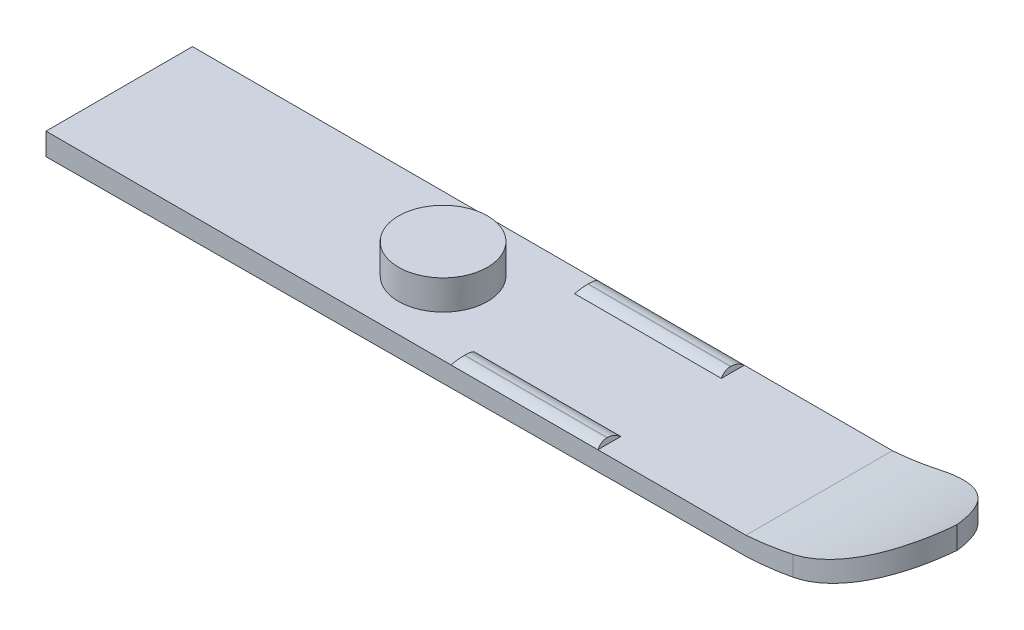
ISO-10303-21;
HEADER;
FILE_DESCRIPTION(('STEP AP214'),'2;1');
FILE_NAME('part.step','',(''),(''),'','','');
FILE_SCHEMA(('AUTOMOTIVE_DESIGN { 1 0 10303 214 1 1 1 1 }'));
ENDSEC;
DATA;
#1=APPLICATION_CONTEXT('core data for automotive mechanical design processes');
#2=APPLICATION_PROTOCOL_DEFINITION('international standard','automotive_design',2000,#1);
#3=PRODUCT_CONTEXT('',#1,'mechanical');
#4=PRODUCT('Part','Part','',(#3));
#5=PRODUCT_RELATED_PRODUCT_CATEGORY('part','',(#4));
#6=PRODUCT_DEFINITION_FORMATION('','',#4);
#7=PRODUCT_DEFINITION_CONTEXT('part definition',#1,'design');
#8=PRODUCT_DEFINITION('design','',#6,#7);
#9=PRODUCT_DEFINITION_SHAPE('','',#8);
#10=(LENGTH_UNIT() NAMED_UNIT(*) SI_UNIT(.MILLI.,.METRE.));
#11=(NAMED_UNIT(*) PLANE_ANGLE_UNIT() SI_UNIT($,.RADIAN.));
#12=(NAMED_UNIT(*) SI_UNIT($,.STERADIAN.) SOLID_ANGLE_UNIT());
#13=UNCERTAINTY_MEASURE_WITH_UNIT(LENGTH_MEASURE(1.E-05),#10,'distance_accuracy_value','');
#14=(GEOMETRIC_REPRESENTATION_CONTEXT(3) GLOBAL_UNCERTAINTY_ASSIGNED_CONTEXT((#13)) GLOBAL_UNIT_ASSIGNED_CONTEXT((#10,
#11,#12)) REPRESENTATION_CONTEXT('',''));
#15=CARTESIAN_POINT('',(0.,0.,0.));
#16=DIRECTION('',(0.,0.,1.));
#17=DIRECTION('',(1.,0.,0.));
#18=AXIS2_PLACEMENT_3D('',#15,#16,#17);
#19=CARTESIAN_POINT('',(-20.3714692927911,1.20972602212736,7.9));
#20=DIRECTION('',(0.,-1.,0.));
#21=DIRECTION('',(0.,0.,-1.));
#22=AXIS2_PLACEMENT_3D('',#19,#20,#21);
#23=PLANE('',#22);
#24=CARTESIAN_POINT('',(-2.90200639518944,1.20972602212736,3.95));
#25=DIRECTION('',(0.,-1.,0.));
#26=DIRECTION('',(0.,0.,-1.));
#27=AXIS2_PLACEMENT_3D('',#24,#25,#26);
#28=CIRCLE('',#27,2.4);
#29=CARTESIAN_POINT('',(-2.90200639518944,1.20972602212736,1.55));
#30=VERTEX_POINT('',#29);
#31=EDGE_CURVE('E311',#30,#30,#28,.F.);
#32=ORIENTED_EDGE('',*,*,#31,.F.);
#33=EDGE_LOOP('',(#32));
#34=FACE_BOUND('',#33,.T.);
#35=DIRECTION('',(0.,0.,1.));
#36=VECTOR('',#35,1.);
#37=CARTESIAN_POINT('',(1.47763421060105,1.20972602212736,7.9));
#38=LINE('',#37,#36);
#39=CARTESIAN_POINT('',(1.47763421060105,1.20972602212736,6.66307065033764));
#40=VERTEX_POINT('',#39);
#41=CARTESIAN_POINT('',(1.47763421060105,1.20972602212736,7.9));
#42=VERTEX_POINT('',#41);
#43=EDGE_CURVE('E150',#40,#42,#38,.T.);
#44=ORIENTED_EDGE('',*,*,#43,.F.);
#45=DIRECTION('',(-1.,0.,0.));
#46=VECTOR('',#45,1.);
#47=CARTESIAN_POINT('',(1.47763421060105,1.20972602212736,6.66307065033764));
#48=LINE('',#47,#46);
#49=CARTESIAN_POINT('',(9.39983038858128,1.20972602212736,6.66307065033764));
#50=VERTEX_POINT('',#49);
#51=EDGE_CURVE('E161',#50,#40,#48,.T.);
#52=ORIENTED_EDGE('',*,*,#51,.F.);
#53=DIRECTION('',(0.,0.,-1.));
#54=VECTOR('',#53,1.);
#55=CARTESIAN_POINT('',(9.39983038858128,1.20972602212736,6.66307065033764));
#56=LINE('',#55,#54);
#57=CARTESIAN_POINT('',(9.39983038858128,1.20972602212736,7.9));
#58=VERTEX_POINT('',#57);
#59=EDGE_CURVE('E177',#58,#50,#56,.T.);
#60=ORIENTED_EDGE('',*,*,#59,.F.);
#61=DIRECTION('',(-1.,0.,0.));
#62=VECTOR('',#61,1.);
#63=CARTESIAN_POINT('',(-20.3714692927911,1.20972602212736,7.9));
#64=LINE('',#63,#62);
#65=CARTESIAN_POINT('',(17.3880327158776,1.20972602212736,7.9));
#66=VERTEX_POINT('',#65);
#67=EDGE_CURVE('E204',#66,#58,#64,.T.);
#68=ORIENTED_EDGE('',*,*,#67,.F.);
#69=DIRECTION('',(0.,0.,-1.));
#70=VECTOR('',#69,1.);
#71=CARTESIAN_POINT('',(17.3880327158776,1.20972602212736,7.9));
#72=LINE('',#71,#70);
#73=CARTESIAN_POINT('',(17.3880327158776,1.20972602212736,0.));
#74=VERTEX_POINT('',#73);
#75=EDGE_CURVE('E235',#66,#74,#72,.T.);
#76=ORIENTED_EDGE('',*,*,#75,.T.);
#77=DIRECTION('',(-1.,0.,0.));
#78=VECTOR('',#77,1.);
#79=CARTESIAN_POINT('',(-20.3714692927911,1.20972602212736,0.));
#80=LINE('',#79,#78);
#81=CARTESIAN_POINT('',(9.39983038858128,1.20972602212736,0.));
#82=VERTEX_POINT('',#81);
#83=EDGE_CURVE('E218',#74,#82,#80,.T.);
#84=ORIENTED_EDGE('',*,*,#83,.T.);
#85=DIRECTION('',(0.,0.,-1.));
#86=VECTOR('',#85,1.);
#87=CARTESIAN_POINT('',(9.39983038858128,1.20972602212736,1.23692934966236));
#88=LINE('',#87,#86);
#89=CARTESIAN_POINT('',(9.39983038858128,1.20972602212736,1.23692934966236));
#90=VERTEX_POINT('',#89);
#91=EDGE_CURVE('E190',#90,#82,#88,.T.);
#92=ORIENTED_EDGE('',*,*,#91,.F.);
#93=DIRECTION('',(1.,0.,0.));
#94=VECTOR('',#93,1.);
#95=CARTESIAN_POINT('',(1.47763421060105,1.20972602212736,1.23692934966236));
#96=LINE('',#95,#94);
#97=CARTESIAN_POINT('',(1.47763421060105,1.20972602212736,1.23692934966236));
#98=VERTEX_POINT('',#97);
#99=EDGE_CURVE('E193',#98,#90,#96,.T.);
#100=ORIENTED_EDGE('',*,*,#99,.F.);
#101=DIRECTION('',(0.,0.,1.));
#102=VECTOR('',#101,1.);
#103=CARTESIAN_POINT('',(1.47763421060105,1.20972602212736,0.));
#104=LINE('',#103,#102);
#105=CARTESIAN_POINT('',(1.47763421060105,1.20972602212736,0.));
#106=VERTEX_POINT('',#105);
#107=EDGE_CURVE('E170',#106,#98,#104,.T.);
#108=ORIENTED_EDGE('',*,*,#107,.F.);
#109=CARTESIAN_POINT('',(-20.3714692927911,1.20972602212736,0.));
#110=VERTEX_POINT('',#109);
#111=EDGE_CURVE('E217',#106,#110,#80,.T.);
#112=ORIENTED_EDGE('',*,*,#111,.T.);
#113=DIRECTION('',(0.,0.,-1.));
#114=VECTOR('',#113,1.);
#115=CARTESIAN_POINT('',(-20.3714692927911,1.20972602212736,7.9));
#116=LINE('',#115,#114);
#117=CARTESIAN_POINT('',(-20.3714692927911,1.20972602212736,7.9));
#118=VERTEX_POINT('',#117);
#119=EDGE_CURVE('E232',#118,#110,#116,.T.);
#120=ORIENTED_EDGE('',*,*,#119,.F.);
#121=EDGE_CURVE('E163',#42,#118,#64,.T.);
#122=ORIENTED_EDGE('',*,*,#121,.F.);
#123=EDGE_LOOP('',(#44,#52,#60,#68,#76,#84,#92,#100,#108,#112,#120,#122));
#124=FACE_BOUND('',#123,.T.);
#125=ADVANCED_FACE('F41',(#34,#124),#23,.F.);
#126=CARTESIAN_POINT('',(16.0205885131337,19.2104128948966,7.9));
#127=DIRECTION('',(0.,0.,-1.));
#128=DIRECTION('',(-1.,0.,0.));
#129=AXIS2_PLACEMENT_3D('',#126,#127,#128);
#130=CYLINDRICAL_SURFACE('',#129,18.052551939798);
#131=CARTESIAN_POINT('',(19.9383096366509,1.58809486526577,7.9));
#132=CARTESIAN_POINT('',(20.0837722084435,1.62041552146105,7.90001383427936));
#133=CARTESIAN_POINT('',(20.2287991411209,1.65456483707399,7.89365287426201));
#134=CARTESIAN_POINT('',(20.5168941832305,1.72614219842089,7.86851106389944));
#135=CARTESIAN_POINT('',(20.6599630825422,1.76356887410111,7.84973538205175));
#136=CARTESIAN_POINT('',(20.9427710687773,1.84123831097853,7.80016449416714));
#137=CARTESIAN_POINT('',(21.0825185299709,1.88147268637815,7.76940392022163));
#138=CARTESIAN_POINT('',(21.3581716280648,1.9643816242335,7.6962849069032));
#139=CARTESIAN_POINT('',(21.4940769186056,2.00705640564253,7.65392542558031));
#140=CARTESIAN_POINT('',(21.8944146334147,2.13788466961709,7.51018833264277));
#141=CARTESIAN_POINT('',(22.1520793167205,2.22901184082297,7.3920429104518));
#142=CARTESIAN_POINT('',(22.6430744721359,2.4143865242675,7.11473712781345));
#143=CARTESIAN_POINT('',(22.8763829963443,2.50863675172997,6.95554021553236));
#144=CARTESIAN_POINT('',(23.3232602689301,2.69899200929397,6.59168537861588));
#145=CARTESIAN_POINT('',(23.5355175862763,2.79499758734465,6.38534226728231));
#146=CARTESIAN_POINT('',(23.8252589758354,2.93179874554959,6.04859492653628));
#147=CARTESIAN_POINT('',(23.9171177301469,2.97622552025095,5.93171879528925));
#148=CARTESIAN_POINT('',(24.0905502872457,3.06173919118939,5.68945345400096));
#149=CARTESIAN_POINT('',(24.172129274515,3.10282776726372,5.56406858473365));
#150=CARTESIAN_POINT('',(24.3225227351748,3.17983239204903,5.30835908756883));
#151=CARTESIAN_POINT('',(24.3915804344256,3.21584304239531,5.17820598485265));
#152=CARTESIAN_POINT('',(24.5183176086219,3.28281525487773,4.91130152552452));
#153=CARTESIAN_POINT('',(24.5760032965473,3.31377957241364,4.77455382291756));
#154=CARTESIAN_POINT('',(24.6791931588832,3.36974858158,4.49564647826506));
#155=CARTESIAN_POINT('',(24.7247198829205,3.39476429571693,4.35349742083868));
#156=CARTESIAN_POINT('',(24.8030368279536,3.43811985306957,4.06481237080371));
#157=CARTESIAN_POINT('',(24.8358342175239,3.45646345334548,3.91827889752486));
#158=CARTESIAN_POINT('',(24.887291586246,3.48536598831265,3.62709684153431));
#159=CARTESIAN_POINT('',(24.9063881762548,3.49616502133498,3.4825494389603));
#160=CARTESIAN_POINT('',(24.9319149274077,3.51063795080042,3.1920105861324));
#161=CARTESIAN_POINT('',(24.9383467743166,3.51431279552124,3.0460193306656));
#162=CARTESIAN_POINT('',(24.9383096366509,3.51427064585082,2.9));
#163=B_SPLINE_CURVE_WITH_KNOTS('',3,(#131,#132,#133,#134,#135,#136,#137,#138,#139,#140,#141,
#142,#143,#144,#145,#146,#147,#148,#149,#150,#151,#152,#153,#154,#155,#156,#157,#158,#159,#160,
#161,#162),.UNSPECIFIED.,.F.,.F.,(4,2,2,2,2,2,2,2,2,2,2,2,2,2,2,4),(0.,0.446838697406237,
0.893491483937148,1.33886306188571,1.78427466146889,2.67319258880924,3.56290474921737,
4.49156948044443,4.95653090618483,5.42125688736263,5.87566295045468,6.3298200612866,
6.78312896416797,7.23618221266622,7.67406521650563,8.1118899311484),.UNSPECIFIED.);
#164=CARTESIAN_POINT('',(19.9383096366509,1.58809486526577,7.9));
#165=VERTEX_POINT('',#164);
#166=CARTESIAN_POINT('',(24.8268165661744,3.45144785854531,3.95));
#167=VERTEX_POINT('',#166);
#168=EDGE_CURVE('E238',#165,#167,#163,.T.);
#169=ORIENTED_EDGE('',*,*,#168,.T.);
#170=CARTESIAN_POINT('',(24.9383096366509,3.51427064585082,5.));
#171=CARTESIAN_POINT('',(24.9383334055816,3.51429742944345,4.87032216753717));
#172=CARTESIAN_POINT('',(24.9332658339713,3.51140535585177,4.74065822163368));
#173=CARTESIAN_POINT('',(24.9131273667041,3.49998231363809,4.48241970867545));
#174=CARTESIAN_POINT('',(24.8980612485307,3.49145403810177,4.35384465103151));
#175=CARTESIAN_POINT('',(24.8582068358537,3.469014549252,4.09937171321881));
#176=CARTESIAN_POINT('',(24.833468622304,3.45513106944337,3.97346350904079));
#177=CARTESIAN_POINT('',(24.7745834075047,3.42233680157065,3.72453377469601));
#178=CARTESIAN_POINT('',(24.7404356583829,3.40342561390725,3.60151247482488));
#179=CARTESIAN_POINT('',(24.6631863127689,3.36105749833744,3.35937257874112));
#180=CARTESIAN_POINT('',(24.620101034436,3.33760886008644,3.24024732173192));
#181=CARTESIAN_POINT('',(24.5253792803499,3.28665524180156,3.006325576444));
#182=CARTESIAN_POINT('',(24.4737395494328,3.25914871808774,2.89153075648871));
#183=CARTESIAN_POINT('',(24.306587999863,3.17131397119426,2.55438907258253));
#184=CARTESIAN_POINT('',(24.1788598446506,3.10567959344,2.33933458902198));
#185=CARTESIAN_POINT('',(23.8849092277964,2.96000467665411,1.91863718242123));
#186=CARTESIAN_POINT('',(23.7166305067581,2.87928048430082,1.71468308674813));
#187=CARTESIAN_POINT('',(23.3515070398557,2.7121532358479,1.33678721823465));
#188=CARTESIAN_POINT('',(23.1546486956646,2.6257474872027,1.1628598189728));
#189=CARTESIAN_POINT('',(22.7142549269774,2.44282093259717,0.831310759395116));
#190=CARTESIAN_POINT('',(22.4679836318407,2.34619878635566,0.677371760867853));
#191=CARTESIAN_POINT('',(21.9510974824625,2.15758089216579,0.413866222394113));
#192=CARTESIAN_POINT('',(21.6804989804,2.06558210040027,0.304270144726083));
#193=CARTESIAN_POINT('',(21.2841368790089,1.94180223443334,0.182965092553986));
#194=CARTESIAN_POINT('',(21.165410068322,1.90604649477666,0.151351742271734));
#195=CARTESIAN_POINT('',(20.9253928506725,1.83649292462452,0.0968591505892026));
#196=CARTESIAN_POINT('',(20.8041028924519,1.80269475522122,0.0739783934861437));
#197=CARTESIAN_POINT('',(20.5594527002024,1.73730845235968,0.0371884904760836));
#198=CARTESIAN_POINT('',(20.4360905230308,1.70572255545584,0.0232883102388257));
#199=CARTESIAN_POINT('',(20.1880277885934,1.64500706798471,0.00468856477982519));
#200=CARTESIAN_POINT('',(20.0633267490706,1.61587839842107,-7.56516732623364E-06));
#201=CARTESIAN_POINT('',(19.9383096366509,1.58809486526577,0.));
#202=B_SPLINE_CURVE_WITH_KNOTS('',3,(#170,#171,#172,#173,#174,#175,#176,#177,#178,#179,#180,
#181,#182,#183,#184,#185,#186,#187,#188,#189,#190,#191,#192,#193,#194,#195,#196,#197,#198,#199,
#200,#201),.UNSPECIFIED.,.F.,.F.,(4,2,2,2,2,2,2,2,2,2,2,2,2,2,2,4),(0.,0.388880435287676,
0.777575190238171,1.16428343064395,1.55102241558815,1.93706141045994,2.32324764081218,
3.09577701405761,3.92191766795795,4.74845269986249,5.66260052600484,6.57613841317846,
6.95976113095716,7.34331723361619,7.72725566640835,8.11133737122979),.UNSPECIFIED.);
#203=CARTESIAN_POINT('',(19.9383096366509,1.58809486526577,0.));
#204=VERTEX_POINT('',#203);
#205=EDGE_CURVE('E246',#167,#204,#202,.T.);
#206=ORIENTED_EDGE('',*,*,#205,.T.);
#207=CARTESIAN_POINT('',(16.0205885131337,19.2104128948966,0.));
#208=DIRECTION('',(0.,0.,-1.));
#209=DIRECTION('',(1.,0.,0.));
#210=AXIS2_PLACEMENT_3D('',#207,#208,#209);
#211=CIRCLE('',#210,18.052551939798);
#212=EDGE_CURVE('E215',#204,#74,#211,.T.);
#213=ORIENTED_EDGE('',*,*,#212,.T.);
#214=ORIENTED_EDGE('',*,*,#75,.F.);
#215=CARTESIAN_POINT('',(16.0205885131337,19.2104128948966,7.9));
#216=DIRECTION('',(0.,0.,-1.));
#217=DIRECTION('',(1.,0.,0.));
#218=AXIS2_PLACEMENT_3D('',#215,#216,#217);
#219=CIRCLE('',#218,18.052551939798);
#220=EDGE_CURVE('E201',#165,#66,#219,.T.);
#221=ORIENTED_EDGE('',*,*,#220,.F.);
#222=EDGE_LOOP('',(#169,#206,#213,#214,#221));
#223=FACE_BOUND('',#222,.T.);
#224=ADVANCED_FACE('F256',(#223),#130,.F.);
#225=CARTESIAN_POINT('',(-20.3714692927911,0.0137689948609054,7.9));
#226=DIRECTION('',(1.,0.,0.));
#227=DIRECTION('',(0.,0.,-1.));
#228=AXIS2_PLACEMENT_3D('',#225,#226,#227);
#229=PLANE('',#228);
#230=DIRECTION('',(0.,-1.,0.));
#231=VECTOR('',#230,1.);
#232=CARTESIAN_POINT('',(-20.3714692927911,0.0137689948609054,0.));
#233=LINE('',#232,#231);
#234=CARTESIAN_POINT('',(-20.3714692927911,0.0137689948609054,0.));
#235=VERTEX_POINT('',#234);
#236=EDGE_CURVE('E221',#110,#235,#233,.T.);
#237=ORIENTED_EDGE('',*,*,#236,.T.);
#238=DIRECTION('',(0.,0.,-1.));
#239=VECTOR('',#238,1.);
#240=CARTESIAN_POINT('',(-20.3714692927911,0.0137689948609054,7.9));
#241=LINE('',#240,#239);
#242=CARTESIAN_POINT('',(-20.3714692927911,0.0137689948609054,7.9));
#243=VERTEX_POINT('',#242);
#244=EDGE_CURVE('E229',#243,#235,#241,.T.);
#245=ORIENTED_EDGE('',*,*,#244,.F.);
#246=DIRECTION('',(0.,-1.,0.));
#247=VECTOR('',#246,1.);
#248=CARTESIAN_POINT('',(-20.3714692927911,0.0137689948609054,7.9));
#249=LINE('',#248,#247);
#250=EDGE_CURVE('E207',#118,#243,#249,.T.);
#251=ORIENTED_EDGE('',*,*,#250,.F.);
#252=ORIENTED_EDGE('',*,*,#119,.T.);
#253=EDGE_LOOP('',(#237,#245,#251,#252));
#254=FACE_BOUND('',#253,.T.);
#255=ADVANCED_FACE('F260',(#254),#229,.F.);
#256=CARTESIAN_POINT('',(-20.3714692927911,0.0137689948609054,7.9));
#257=DIRECTION('',(-0.00552914138962596,0.999984714180919,0.));
#258=DIRECTION('',(-0.999984714180919,-0.00552914138962596,0.));
#259=AXIS2_PLACEMENT_3D('',#256,#257,#258);
#260=PLANE('',#259);
#261=CARTESIAN_POINT('',(-2.89592794678577,0.110395210834079,3.95));
#262=DIRECTION('',(0.00552914138962596,-0.999984714180919,0.));
#263=DIRECTION('',(0.999984714180919,0.00552914138962596,0.));
#264=AXIS2_PLACEMENT_3D('',#261,#262,#263);
#265=CIRCLE('',#264,1.2);
#266=CARTESIAN_POINT('',(-1.69594628976866,0.11703018050163,3.95));
#267=VERTEX_POINT('',#266);
#268=EDGE_CURVE('E173',#267,#267,#265,.T.);
#269=ORIENTED_EDGE('',*,*,#268,.F.);
#270=EDGE_LOOP('',(#269));
#271=FACE_BOUND('',#270,.T.);
#272=DIRECTION('',(0.999984714180919,0.00552914138962596,0.));
#273=VECTOR('',#272,1.);
#274=CARTESIAN_POINT('',(-20.3714692927911,0.0137689948609054,0.));
#275=LINE('',#274,#273);
#276=CARTESIAN_POINT('',(17.3880327158776,0.222549811654493,0.));
#277=VERTEX_POINT('',#276);
#278=EDGE_CURVE('E223',#235,#277,#275,.T.);
#279=ORIENTED_EDGE('',*,*,#278,.T.);
#280=DIRECTION('',(0.,0.,-1.));
#281=VECTOR('',#280,1.);
#282=CARTESIAN_POINT('',(17.3880327158776,0.222549811654493,7.9));
#283=LINE('',#282,#281);
#284=CARTESIAN_POINT('',(17.3880327158776,0.222549811654493,7.9));
#285=VERTEX_POINT('',#284);
#286=EDGE_CURVE('E214',#285,#277,#283,.T.);
#287=ORIENTED_EDGE('',*,*,#286,.F.);
#288=DIRECTION('',(0.999984714180919,0.00552914138962596,0.));
#289=VECTOR('',#288,1.);
#290=CARTESIAN_POINT('',(-20.3714692927911,0.0137689948609054,7.9));
#291=LINE('',#290,#289);
#292=EDGE_CURVE('E209',#243,#285,#291,.T.);
#293=ORIENTED_EDGE('',*,*,#292,.F.);
#294=ORIENTED_EDGE('',*,*,#244,.T.);
#295=EDGE_LOOP('',(#279,#287,#293,#294));
#296=FACE_BOUND('',#295,.T.);
#297=ADVANCED_FACE('F292',(#271,#296),#260,.F.);
#298=CARTESIAN_POINT('',(16.6540021174641,17.6260747175619,7.9));
#299=DIRECTION('',(0.,0.,-1.));
#300=DIRECTION('',(-1.,0.,0.));
#301=AXIS2_PLACEMENT_3D('',#298,#299,#300);
#302=CYLINDRICAL_SURFACE('',#301,17.4189976769602);
#303=CARTESIAN_POINT('',(16.6540021174641,17.6260747175619,0.));
#304=DIRECTION('',(0.,0.,1.));
#305=DIRECTION('',(1.,0.,0.));
#306=AXIS2_PLACEMENT_3D('',#303,#304,#305);
#307=CIRCLE('',#306,17.4189976769602);
#308=CARTESIAN_POINT('',(19.9383096366509,0.519502758535156,0.));
#309=VERTEX_POINT('',#308);
#310=EDGE_CURVE('E203',#277,#309,#307,.T.);
#311=ORIENTED_EDGE('',*,*,#310,.T.);
#312=CARTESIAN_POINT('',(19.9383096366509,0.519502758535156,0.));
#313=CARTESIAN_POINT('',(20.082349632447,0.547139180155456,-1.47710559769099E-05));
#314=CARTESIAN_POINT('',(20.2260081566969,0.576624058054855,0.00622356787463908));
#315=CARTESIAN_POINT('',(20.5114814264774,0.638946996251726,0.0309002235852575));
#316=CARTESIAN_POINT('',(20.653296890188,0.671783703420837,0.0493336335775546));
#317=CARTESIAN_POINT('',(20.933706654848,0.740388032407411,0.0980227726361486));
#318=CARTESIAN_POINT('',(21.0723092210146,0.776146726279844,0.128243480773935));
#319=CARTESIAN_POINT('',(21.3457870372056,0.850236641531285,0.200102330871485));
#320=CARTESIAN_POINT('',(21.4806619735513,0.888568078480682,0.241741430483611));
#321=CARTESIAN_POINT('',(21.8780907491528,1.00661680675722,0.383062375049114));
#322=CARTESIAN_POINT('',(22.1340354685513,1.08953416617376,0.499251812507506));
#323=CARTESIAN_POINT('',(22.6220434324691,1.25930985503517,0.772009789945697));
#324=CARTESIAN_POINT('',(22.8540858909535,1.3461715215504,0.928613066938709));
#325=CARTESIAN_POINT('',(23.298766423286,1.52240336838673,1.28620555164235));
#326=CARTESIAN_POINT('',(23.5101074588791,1.61171653010243,1.48883994632623));
#327=CARTESIAN_POINT('',(23.8957324799842,1.78235780980427,1.93006317541353));
#328=CARTESIAN_POINT('',(24.0700103202694,1.86368460241701,2.16865796100585));
#329=CARTESIAN_POINT('',(24.2980233391455,1.97367991645979,2.54757996400688));
#330=CARTESIAN_POINT('',(24.3681559063795,2.00818379055536,2.67660383419931));
#331=CARTESIAN_POINT('',(24.4971607671627,2.07256930145668,2.94123698542312));
#332=CARTESIAN_POINT('',(24.5560388944514,2.10245333141415,3.0768428087378));
#333=CARTESIAN_POINT('',(24.6617442029449,2.15671533699844,3.35347114625477));
#334=CARTESIAN_POINT('',(24.7085914805883,2.18110248621698,3.49448416924663));
#335=CARTESIAN_POINT('',(24.7897007039871,2.22367272680258,3.78092221088186));
#336=CARTESIAN_POINT('',(24.8239690649814,2.24185898028462,3.92634493949424));
#337=CARTESIAN_POINT('',(24.8803897421478,2.27195154093074,4.22553122658313));
#338=CARTESIAN_POINT('',(24.9020766101499,2.28361607994093,4.37940864604081));
#339=CARTESIAN_POINT('',(24.92379756949,2.29532061759101,4.61146516288898));
#340=CARTESIAN_POINT('',(24.9292363367831,2.2982567573981,4.689035783985));
#341=CARTESIAN_POINT('',(24.936492859586,2.30217715667328,4.84439916715569));
#342=CARTESIAN_POINT('',(24.9383104350016,2.30316131906292,4.92219194008605));
#343=CARTESIAN_POINT('',(24.9383096366509,2.30315955766192,5.));
#344=B_SPLINE_CURVE_WITH_KNOTS('',3,(#312,#313,#314,#315,#316,#317,#318,#319,#320,#321,#322,
#323,#324,#325,#326,#327,#328,#329,#330,#331,#332,#333,#334,#335,#336,#337,#338,#339,#340,#341,
#342,#343),.UNSPECIFIED.,.F.,.F.,(4,2,2,2,2,2,2,2,2,2,2,2,2,2,2,4),(0.,0.43981669320457,
0.879456530063871,1.31779999427182,1.75618023328379,2.63112254693982,3.50681942150022,
4.42091515307173,5.33516232742926,5.78719733078274,6.23899738256008,6.6900377612416,
7.14084778899181,7.60741777488652,7.84077271830294,8.07413926696033),.UNSPECIFIED.);
#345=CARTESIAN_POINT('',(24.8268165661744,2.24340316620586,3.95));
#346=VERTEX_POINT('',#345);
#347=EDGE_CURVE('E271',#309,#346,#344,.T.);
#348=ORIENTED_EDGE('',*,*,#347,.T.);
#349=CARTESIAN_POINT('',(24.9383096366509,2.30315955766192,2.9));
#350=CARTESIAN_POINT('',(24.938332853705,2.30318582281256,3.03065260516508));
#351=CARTESIAN_POINT('',(24.9331896768801,2.30039180901935,3.16129196987954));
#352=CARTESIAN_POINT('',(24.9127455549839,2.28935787462275,3.42148474059906));
#353=CARTESIAN_POINT('',(24.8974491873509,2.2811204081388,3.55103860934567));
#354=CARTESIAN_POINT('',(24.856971791874,2.25944657211906,3.80749713999408));
#355=CARTESIAN_POINT('',(24.8318390547586,2.24603560593447,3.93441160177417));
#356=CARTESIAN_POINT('',(24.7719960175966,2.21436464824308,4.18534545419849));
#357=CARTESIAN_POINT('',(24.7372850098283,2.19610429842742,4.30936463018033));
#358=CARTESIAN_POINT('',(24.6587292007735,2.155206065155,4.55349679068641));
#359=CARTESIAN_POINT('',(24.6148998300104,2.13257558162978,4.67361598297134));
#360=CARTESIAN_POINT('',(24.5185060054288,2.08342421370272,4.90949154365658));
#361=CARTESIAN_POINT('',(24.465938238074,2.05690185397888,5.02524623656547));
#362=CARTESIAN_POINT('',(24.2957255772735,1.97226963596719,5.36517570795578));
#363=CARTESIAN_POINT('',(24.1655818753924,1.90910028997712,5.5819834638829));
#364=CARTESIAN_POINT('',(23.8664165359673,1.76948403361256,6.00507714119334));
#365=CARTESIAN_POINT('',(23.6954096973321,1.69243913276426,6.20974898323675));
#366=CARTESIAN_POINT('',(23.3242722343588,1.53353639614786,6.58858338333256));
#367=CARTESIAN_POINT('',(23.124128208049,1.4516763559852,6.76273182012659));
#368=CARTESIAN_POINT('',(22.6786035635208,1.28020066299176,7.09219137704735));
#369=CARTESIAN_POINT('',(22.4307373066119,1.19058119291818,7.24418023385036));
#370=CARTESIAN_POINT('',(22.0412074268842,1.06049596936393,7.43860666956024));
#371=CARTESIAN_POINT('',(21.9083810645447,1.01785023152943,7.49783105403783));
#372=CARTESIAN_POINT('',(21.6375419581101,0.934585402456014,7.60465302444171));
#373=CARTESIAN_POINT('',(21.4995318370706,0.893965309801715,7.65225640169372));
#374=CARTESIAN_POINT('',(21.2452550063827,0.822624258188459,7.72763643980568));
#375=CARTESIAN_POINT('',(21.1297092306588,0.791465701327723,7.75745330563563));
#376=CARTESIAN_POINT('',(20.8962982237174,0.731136743852993,7.8088218516998));
#377=CARTESIAN_POINT('',(20.7784334235396,0.701965978182028,7.83037505293438));
#378=CARTESIAN_POINT('',(20.5408320294569,0.645823649564827,7.86501639975513));
#379=CARTESIAN_POINT('',(20.4210938418438,0.618854095723376,7.87809688594137));
#380=CARTESIAN_POINT('',(20.180427948635,0.56732225759281,7.89559432438998));
#381=CARTESIAN_POINT('',(20.0594998273728,0.542760849924558,7.90000813282396));
#382=CARTESIAN_POINT('',(19.9383096366509,0.519502758535158,7.9));
#383=B_SPLINE_CURVE_WITH_KNOTS('',3,(#349,#350,#351,#352,#353,#354,#355,#356,#357,#358,#359,
#360,#361,#362,#363,#364,#365,#366,#367,#368,#369,#370,#371,#372,#373,#374,#375,#376,#377,#378,
#379,#380,#381,#382),.UNSPECIFIED.,.F.,.F.,(4,2,2,2,2,2,2,2,2,2,2,2,2,2,2,2,4),(0.,
0.391805942134254,0.783435363368071,1.17316575985864,1.5629249605713,1.95202988063218,
2.34128268442342,3.11989077525303,3.94939239249708,4.7792767607605,5.68737571929773,
6.14160466232801,6.59560677625964,6.96530874689546,7.33494263791898,7.7049102161987,
8.07501197505948),.UNSPECIFIED.);
#384=CARTESIAN_POINT('',(19.9383096366509,0.519502758535156,7.9));
#385=VERTEX_POINT('',#384);
#386=EDGE_CURVE('E280',#346,#385,#383,.T.);
#387=ORIENTED_EDGE('',*,*,#386,.T.);
#388=CARTESIAN_POINT('',(16.6540021174641,17.6260747175619,7.9));
#389=DIRECTION('',(0.,0.,1.));
#390=DIRECTION('',(1.,0.,0.));
#391=AXIS2_PLACEMENT_3D('',#388,#389,#390);
#392=CIRCLE('',#391,17.4189976769602);
#393=EDGE_CURVE('E211',#285,#385,#392,.T.);
#394=ORIENTED_EDGE('',*,*,#393,.F.);
#395=ORIENTED_EDGE('',*,*,#286,.T.);
#396=EDGE_LOOP('',(#311,#348,#387,#394,#395));
#397=FACE_BOUND('',#396,.T.);
#398=ADVANCED_FACE('F286',(#397),#302,.T.);
#399=CARTESIAN_POINT('',(16.0205885131337,19.2104128948966,7.9));
#400=DIRECTION('',(0.,0.,1.));
#401=DIRECTION('',(1.,0.,0.));
#402=AXIS2_PLACEMENT_3D('',#399,#400,#401);
#403=PLANE('',#402);
#404=ORIENTED_EDGE('',*,*,#393,.T.);
#405=DIRECTION('',(0.,1.,0.));
#406=VECTOR('',#405,1.);
#407=CARTESIAN_POINT('',(19.9383096366509,3.51427064585082,7.9));
#408=LINE('',#407,#406);
#409=EDGE_CURVE('E279',#385,#165,#408,.T.);
#410=ORIENTED_EDGE('',*,*,#409,.T.);
#411=ORIENTED_EDGE('',*,*,#220,.T.);
#412=ORIENTED_EDGE('',*,*,#67,.T.);
#413=DIRECTION('',(1.,0.,0.));
#414=VECTOR('',#413,1.);
#415=CARTESIAN_POINT('',(9.39983038858128,1.20972602212736,7.9));
#416=LINE('',#415,#414);
#417=EDGE_CURVE('E165',#42,#58,#416,.T.);
#418=ORIENTED_EDGE('',*,*,#417,.F.);
#419=ORIENTED_EDGE('',*,*,#121,.T.);
#420=ORIENTED_EDGE('',*,*,#250,.T.);
#421=ORIENTED_EDGE('',*,*,#292,.T.);
#422=EDGE_LOOP('',(#404,#410,#411,#412,#418,#419,#420,#421));
#423=FACE_BOUND('',#422,.T.);
#424=ADVANCED_FACE('F291',(#423),#403,.T.);
#425=CARTESIAN_POINT('',(16.0205885131337,19.2104128948966,0.));
#426=DIRECTION('',(0.,0.,1.));
#427=DIRECTION('',(1.,0.,0.));
#428=AXIS2_PLACEMENT_3D('',#425,#426,#427);
#429=PLANE('',#428);
#430=ORIENTED_EDGE('',*,*,#212,.F.);
#431=DIRECTION('',(0.,1.,0.));
#432=VECTOR('',#431,1.);
#433=CARTESIAN_POINT('',(19.9383096366509,19.2104128948966,0.));
#434=LINE('',#433,#432);
#435=EDGE_CURVE('E389',#204,#309,#434,.F.);
#436=ORIENTED_EDGE('',*,*,#435,.T.);
#437=ORIENTED_EDGE('',*,*,#310,.F.);
#438=ORIENTED_EDGE('',*,*,#278,.F.);
#439=ORIENTED_EDGE('',*,*,#236,.F.);
#440=ORIENTED_EDGE('',*,*,#111,.F.);
#441=DIRECTION('',(-1.,0.,0.));
#442=VECTOR('',#441,1.);
#443=CARTESIAN_POINT('',(9.39983038858128,1.20972602212736,0.));
#444=LINE('',#443,#442);
#445=EDGE_CURVE('E167',#82,#106,#444,.T.);
#446=ORIENTED_EDGE('',*,*,#445,.F.);
#447=ORIENTED_EDGE('',*,*,#83,.F.);
#448=EDGE_LOOP('',(#430,#436,#437,#438,#439,#440,#446,#447));
#449=FACE_BOUND('',#448,.T.);
#450=ADVANCED_FACE('F294',(#449),#429,.F.);
#451=CARTESIAN_POINT('',(19.9383096366509,19.2104128948966,2.9));
#452=DIRECTION('',(0.,-1.,0.));
#453=DIRECTION('',(0.,0.,-1.));
#454=AXIS2_PLACEMENT_3D('',#451,#452,#453);
#455=CYLINDRICAL_SURFACE('',#454,5.);
#456=ORIENTED_EDGE('',*,*,#409,.F.);
#457=ORIENTED_EDGE('',*,*,#386,.F.);
#458=DIRECTION('',(0.,-1.,0.));
#459=VECTOR('',#458,1.);
#460=CARTESIAN_POINT('',(24.8268165661744,2.01688670219299,3.95));
#461=LINE('',#460,#459);
#462=EDGE_CURVE('E200',#167,#346,#461,.T.);
#463=ORIENTED_EDGE('',*,*,#462,.F.);
#464=ORIENTED_EDGE('',*,*,#168,.F.);
#465=EDGE_LOOP('',(#456,#457,#463,#464));
#466=FACE_BOUND('',#465,.T.);
#467=ADVANCED_FACE('F253',(#466),#455,.T.);
#468=CARTESIAN_POINT('',(19.9383096366509,2.30315955766192,5.));
#469=DIRECTION('',(0.,1.,0.));
#470=DIRECTION('',(0.,0.,1.));
#471=AXIS2_PLACEMENT_3D('',#468,#469,#470);
#472=CYLINDRICAL_SURFACE('',#471,5.);
#473=ORIENTED_EDGE('',*,*,#347,.F.);
#474=ORIENTED_EDGE('',*,*,#435,.F.);
#475=ORIENTED_EDGE('',*,*,#205,.F.);
#476=ORIENTED_EDGE('',*,*,#462,.T.);
#477=EDGE_LOOP('',(#473,#474,#475,#476));
#478=FACE_BOUND('',#477,.T.);
#479=ADVANCED_FACE('F263',(#478),#472,.T.);
#480=CARTESIAN_POINT('',(-2.90200639518944,2.80972602212736,3.95));
#481=DIRECTION('',(0.,-1.,0.));
#482=DIRECTION('',(0.,0.,-1.));
#483=AXIS2_PLACEMENT_3D('',#480,#481,#482);
#484=CYLINDRICAL_SURFACE('',#483,2.4);
#485=CARTESIAN_POINT('',(-2.90200639518944,2.80972602212736,3.95));
#486=DIRECTION('',(0.,1.,0.));
#487=DIRECTION('',(0.,0.,1.));
#488=AXIS2_PLACEMENT_3D('',#485,#486,#487);
#489=CIRCLE('',#488,2.4);
#490=CARTESIAN_POINT('',(-2.90200639518944,2.80972602212736,6.35));
#491=VERTEX_POINT('',#490);
#492=EDGE_CURVE('E182',#491,#491,#489,.T.);
#493=ORIENTED_EDGE('',*,*,#492,.F.);
#494=EDGE_LOOP('',(#493));
#495=FACE_BOUND('',#494,.T.);
#496=ORIENTED_EDGE('',*,*,#31,.T.);
#497=EDGE_LOOP('',(#496));
#498=FACE_BOUND('',#497,.T.);
#499=ADVANCED_FACE('F267',(#495,#498),#484,.T.);
#500=CARTESIAN_POINT('',(-2.90200639518944,2.80972602212736,3.95));
#501=DIRECTION('',(0.,1.,0.));
#502=DIRECTION('',(0.,0.,1.));
#503=AXIS2_PLACEMENT_3D('',#500,#501,#502);
#504=PLANE('',#503);
#505=ORIENTED_EDGE('',*,*,#492,.T.);
#506=EDGE_LOOP('',(#505));
#507=FACE_BOUND('',#506,.T.);
#508=ADVANCED_FACE('F364',(#507),#504,.T.);
#509=CARTESIAN_POINT('',(1.47763421060105,1.20972602212736,0.));
#510=DIRECTION('',(-0.866025403784438,0.500000000000001,0.));
#511=DIRECTION('',(-0.500000000000001,-0.866025403784438,0.));
#512=AXIS2_PLACEMENT_3D('',#509,#510,#511);
#513=PLANE('',#512);
#514=ORIENTED_EDGE('',*,*,#107,.T.);
#515=CARTESIAN_POINT('',(1.01575399524935,0.40972602212736,0.636929349662364));
#516=DIRECTION('',(-0.866025403784438,0.500000000000001,0.));
#517=DIRECTION('',(0.500000000000001,0.866025403784438,0.));
#518=AXIS2_PLACEMENT_3D('',#515,#516,#517);
#519=ELLIPSE('',#518,1.15470053837925,1.);
#520=CARTESIAN_POINT('',(1.59310426443897,1.40972602212736,0.636929349662364));
#521=VERTEX_POINT('',#520);
#522=EDGE_CURVE('E327',#98,#521,#519,.T.);
#523=ORIENTED_EDGE('',*,*,#522,.T.);
#524=DIRECTION('',(0.,0.,-1.));
#525=VECTOR('',#524,1.);
#526=CARTESIAN_POINT('',(1.59310426443897,1.40972602212736,0.));
#527=LINE('',#526,#525);
#528=CARTESIAN_POINT('',(1.59310426443897,1.40972602212736,0.6));
#529=VERTEX_POINT('',#528);
#530=EDGE_CURVE('E186',#529,#521,#527,.F.);
#531=ORIENTED_EDGE('',*,*,#530,.F.);
#532=CARTESIAN_POINT('',(1.01575399524935,0.40972602212736,0.6));
#533=DIRECTION('',(-0.866025403784438,0.500000000000001,0.));
#534=DIRECTION('',(0.500000000000001,0.866025403784438,0.));
#535=AXIS2_PLACEMENT_3D('',#532,#533,#534);
#536=ELLIPSE('',#535,1.15470053837925,1.);
#537=EDGE_CURVE('E325',#529,#106,#536,.T.);
#538=ORIENTED_EDGE('',*,*,#537,.T.);
#539=EDGE_LOOP('',(#514,#523,#531,#538));
#540=FACE_BOUND('',#539,.T.);
#541=ADVANCED_FACE('F360',(#540),#513,.T.);
#542=CARTESIAN_POINT('',(9.39983038858128,1.20972602212736,1.23692934966236));
#543=DIRECTION('',(0.866025403784438,0.500000000000001,0.));
#544=DIRECTION('',(-0.500000000000001,0.866025403784438,0.));
#545=AXIS2_PLACEMENT_3D('',#542,#543,#544);
#546=PLANE('',#545);
#547=DIRECTION('',(0.,0.,1.));
#548=VECTOR('',#547,1.);
#549=CARTESIAN_POINT('',(9.28436033474335,1.40972602212736,1.23692934966236));
#550=LINE('',#549,#548);
#551=CARTESIAN_POINT('',(9.28436033474335,1.40972602212736,0.636929349662364));
#552=VERTEX_POINT('',#551);
#553=CARTESIAN_POINT('',(9.28436033474335,1.40972602212736,0.6));
#554=VERTEX_POINT('',#553);
#555=EDGE_CURVE('E183',#552,#554,#550,.F.);
#556=ORIENTED_EDGE('',*,*,#555,.F.);
#557=CARTESIAN_POINT('',(9.86171060393298,0.40972602212736,0.636929349662364));
#558=DIRECTION('',(0.866025403784438,0.500000000000001,0.));
#559=DIRECTION('',(0.500000000000001,-0.866025403784438,0.));
#560=AXIS2_PLACEMENT_3D('',#557,#558,#559);
#561=ELLIPSE('',#560,1.15470053837925,1.);
#562=EDGE_CURVE('E323',#552,#90,#561,.T.);
#563=ORIENTED_EDGE('',*,*,#562,.T.);
#564=ORIENTED_EDGE('',*,*,#91,.T.);
#565=CARTESIAN_POINT('',(9.86171060393298,0.40972602212736,0.6));
#566=DIRECTION('',(0.866025403784438,0.500000000000001,0.));
#567=DIRECTION('',(0.500000000000001,-0.866025403784438,0.));
#568=AXIS2_PLACEMENT_3D('',#565,#566,#567);
#569=ELLIPSE('',#568,1.15470053837925,1.);
#570=EDGE_CURVE('E321',#82,#554,#569,.T.);
#571=ORIENTED_EDGE('',*,*,#570,.T.);
#572=EDGE_LOOP('',(#556,#563,#564,#571));
#573=FACE_BOUND('',#572,.T.);
#574=ADVANCED_FACE('F363',(#573),#546,.T.);
#575=CARTESIAN_POINT('',(0.,1.40972602212736,0.));
#576=DIRECTION('',(0.,1.,0.));
#577=DIRECTION('',(0.,0.,1.));
#578=AXIS2_PLACEMENT_3D('',#575,#576,#577);
#579=PLANE('',#578);
#580=ORIENTED_EDGE('',*,*,#530,.T.);
#581=DIRECTION('',(-1.,0.,0.));
#582=VECTOR('',#581,1.);
#583=CARTESIAN_POINT('',(9.28436033474335,1.40972602212736,0.636929349662364));
#584=LINE('',#583,#582);
#585=EDGE_CURVE('E316',#521,#552,#584,.F.);
#586=ORIENTED_EDGE('',*,*,#585,.T.);
#587=ORIENTED_EDGE('',*,*,#555,.T.);
#588=DIRECTION('',(-1.,0.,0.));
#589=VECTOR('',#588,1.);
#590=CARTESIAN_POINT('',(1.59310426443897,1.40972602212736,0.6));
#591=LINE('',#590,#589);
#592=EDGE_CURVE('E313',#554,#529,#591,.T.);
#593=ORIENTED_EDGE('',*,*,#592,.T.);
#594=EDGE_LOOP('',(#580,#586,#587,#593));
#595=FACE_BOUND('',#594,.T.);
#596=ADVANCED_FACE('F359',(#595),#579,.T.);
#597=CARTESIAN_POINT('',(1.47763421060105,1.20972602212736,7.9));
#598=DIRECTION('',(-0.866025403784438,0.500000000000001,0.));
#599=DIRECTION('',(-0.500000000000001,-0.866025403784438,0.));
#600=AXIS2_PLACEMENT_3D('',#597,#598,#599);
#601=PLANE('',#600);
#602=ORIENTED_EDGE('',*,*,#43,.T.);
#603=CARTESIAN_POINT('',(1.01575399524935,0.40972602212736,7.3));
#604=DIRECTION('',(-0.866025403784438,0.500000000000001,0.));
#605=DIRECTION('',(0.500000000000001,0.866025403784438,0.));
#606=AXIS2_PLACEMENT_3D('',#603,#604,#605);
#607=ELLIPSE('',#606,1.15470053837925,1.);
#608=CARTESIAN_POINT('',(1.59310426443897,1.40972602212736,7.3));
#609=VERTEX_POINT('',#608);
#610=EDGE_CURVE('E11',#42,#609,#607,.T.);
#611=ORIENTED_EDGE('',*,*,#610,.T.);
#612=DIRECTION('',(0.,0.,-1.));
#613=VECTOR('',#612,1.);
#614=CARTESIAN_POINT('',(1.59310426443897,1.40972602212736,0.));
#615=LINE('',#614,#613);
#616=CARTESIAN_POINT('',(1.59310426443897,1.40972602212736,7.26307065033764));
#617=VERTEX_POINT('',#616);
#618=EDGE_CURVE('E153',#617,#609,#615,.F.);
#619=ORIENTED_EDGE('',*,*,#618,.F.);
#620=CARTESIAN_POINT('',(1.01575399524935,0.40972602212736,7.26307065033764));
#621=DIRECTION('',(-0.866025403784438,0.500000000000001,0.));
#622=DIRECTION('',(-0.500000000000001,-0.866025403784438,0.));
#623=AXIS2_PLACEMENT_3D('',#620,#621,#622);
#624=ELLIPSE('',#623,1.15470053837925,1.);
#625=EDGE_CURVE('E49',#617,#40,#624,.T.);
#626=ORIENTED_EDGE('',*,*,#625,.T.);
#627=EDGE_LOOP('',(#602,#611,#619,#626));
#628=FACE_BOUND('',#627,.T.);
#629=ADVANCED_FACE('F149',(#628),#601,.T.);
#630=CARTESIAN_POINT('',(9.39983038858128,1.20972602212736,6.66307065033764));
#631=DIRECTION('',(0.866025403784438,0.500000000000001,0.));
#632=DIRECTION('',(-0.500000000000001,0.866025403784438,0.));
#633=AXIS2_PLACEMENT_3D('',#630,#631,#632);
#634=PLANE('',#633);
#635=DIRECTION('',(0.,0.,1.));
#636=VECTOR('',#635,1.);
#637=CARTESIAN_POINT('',(9.28436033474335,1.40972602212736,0.));
#638=LINE('',#637,#636);
#639=CARTESIAN_POINT('',(9.28436033474335,1.40972602212736,7.3));
#640=VERTEX_POINT('',#639);
#641=CARTESIAN_POINT('',(9.28436033474335,1.40972602212736,7.26307065033764));
#642=VERTEX_POINT('',#641);
#643=EDGE_CURVE('E180',#640,#642,#638,.F.);
#644=ORIENTED_EDGE('',*,*,#643,.F.);
#645=CARTESIAN_POINT('',(9.86171060393298,0.40972602212736,7.3));
#646=DIRECTION('',(0.866025403784438,0.500000000000001,0.));
#647=DIRECTION('',(0.500000000000001,-0.866025403784438,0.));
#648=AXIS2_PLACEMENT_3D('',#645,#646,#647);
#649=ELLIPSE('',#648,1.15470053837925,1.);
#650=EDGE_CURVE('E64',#640,#58,#649,.T.);
#651=ORIENTED_EDGE('',*,*,#650,.T.);
#652=ORIENTED_EDGE('',*,*,#59,.T.);
#653=CARTESIAN_POINT('',(9.86171060393298,0.40972602212736,7.26307065033764));
#654=DIRECTION('',(0.866025403784438,0.500000000000001,0.));
#655=DIRECTION('',(-0.500000000000001,0.866025403784438,0.));
#656=AXIS2_PLACEMENT_3D('',#653,#654,#655);
#657=ELLIPSE('',#656,1.15470053837925,1.);
#658=EDGE_CURVE('E56',#50,#642,#657,.T.);
#659=ORIENTED_EDGE('',*,*,#658,.T.);
#660=EDGE_LOOP('',(#644,#651,#652,#659));
#661=FACE_BOUND('',#660,.T.);
#662=ADVANCED_FACE('F334',(#661),#634,.T.);
#663=CARTESIAN_POINT('',(0.,1.40972602212736,0.));
#664=DIRECTION('',(0.,-1.,0.));
#665=DIRECTION('',(0.,0.,-1.));
#666=AXIS2_PLACEMENT_3D('',#663,#664,#665);
#667=PLANE('',#666);
#668=ORIENTED_EDGE('',*,*,#618,.T.);
#669=DIRECTION('',(1.,0.,0.));
#670=VECTOR('',#669,1.);
#671=CARTESIAN_POINT('',(0.,1.40972602212736,7.3));
#672=LINE('',#671,#670);
#673=EDGE_CURVE('E331',#609,#640,#672,.T.);
#674=ORIENTED_EDGE('',*,*,#673,.T.);
#675=ORIENTED_EDGE('',*,*,#643,.T.);
#676=DIRECTION('',(-1.,0.,0.));
#677=VECTOR('',#676,1.);
#678=CARTESIAN_POINT('',(0.,1.40972602212736,7.26307065033764));
#679=LINE('',#678,#677);
#680=EDGE_CURVE('E329',#642,#617,#679,.T.);
#681=ORIENTED_EDGE('',*,*,#680,.T.);
#682=EDGE_LOOP('',(#668,#674,#675,#681));
#683=FACE_BOUND('',#682,.T.);
#684=ADVANCED_FACE('F342',(#683),#667,.F.);
#685=CARTESIAN_POINT('',(1.47763421060105,0.40972602212736,0.636929349662364));
#686=DIRECTION('',(1.,0.,0.));
#687=DIRECTION('',(0.,0.,-1.));
#688=AXIS2_PLACEMENT_3D('',#685,#686,#687);
#689=CYLINDRICAL_SURFACE('',#688,1.);
#690=ORIENTED_EDGE('',*,*,#522,.F.);
#691=ORIENTED_EDGE('',*,*,#99,.T.);
#692=ORIENTED_EDGE('',*,*,#562,.F.);
#693=ORIENTED_EDGE('',*,*,#585,.F.);
#694=EDGE_LOOP('',(#690,#691,#692,#693));
#695=FACE_BOUND('',#694,.T.);
#696=ADVANCED_FACE('F344',(#695),#689,.T.);
#697=CARTESIAN_POINT('',(9.39983038858128,0.40972602212736,0.6));
#698=DIRECTION('',(1.,0.,0.));
#699=DIRECTION('',(0.,0.,-1.));
#700=AXIS2_PLACEMENT_3D('',#697,#698,#699);
#701=CYLINDRICAL_SURFACE('',#700,1.);
#702=ORIENTED_EDGE('',*,*,#570,.F.);
#703=ORIENTED_EDGE('',*,*,#445,.T.);
#704=ORIENTED_EDGE('',*,*,#537,.F.);
#705=ORIENTED_EDGE('',*,*,#592,.F.);
#706=EDGE_LOOP('',(#702,#703,#704,#705));
#707=FACE_BOUND('',#706,.T.);
#708=ADVANCED_FACE('F350',(#707),#701,.T.);
#709=CARTESIAN_POINT('',(9.39983038858128,0.40972602212736,7.3));
#710=DIRECTION('',(1.,0.,0.));
#711=DIRECTION('',(0.,0.,-1.));
#712=AXIS2_PLACEMENT_3D('',#709,#710,#711);
#713=CYLINDRICAL_SURFACE('',#712,1.);
#714=ORIENTED_EDGE('',*,*,#610,.F.);
#715=ORIENTED_EDGE('',*,*,#417,.T.);
#716=ORIENTED_EDGE('',*,*,#650,.F.);
#717=ORIENTED_EDGE('',*,*,#673,.F.);
#718=EDGE_LOOP('',(#714,#715,#716,#717));
#719=FACE_BOUND('',#718,.T.);
#720=ADVANCED_FACE('F340',(#719),#713,.T.);
#721=CARTESIAN_POINT('',(1.47763421060105,0.40972602212736,7.26307065033764));
#722=DIRECTION('',(-1.,0.,0.));
#723=DIRECTION('',(0.,0.,1.));
#724=AXIS2_PLACEMENT_3D('',#721,#722,#723);
#725=CYLINDRICAL_SURFACE('',#724,1.);
#726=ORIENTED_EDGE('',*,*,#658,.F.);
#727=ORIENTED_EDGE('',*,*,#51,.T.);
#728=ORIENTED_EDGE('',*,*,#625,.F.);
#729=ORIENTED_EDGE('',*,*,#680,.F.);
#730=EDGE_LOOP('',(#726,#727,#728,#729));
#731=FACE_BOUND('',#730,.T.);
#732=ADVANCED_FACE('F43',(#731),#725,.T.);
#733=CARTESIAN_POINT('',(-2.90477457300917,1.71037075352355,3.95));
#734=DIRECTION('',(0.00552914138962596,-0.999984714180919,0.));
#735=DIRECTION('',(0.999984714180919,0.00552914138962596,0.));
#736=AXIS2_PLACEMENT_3D('',#733,#734,#735);
#737=CYLINDRICAL_SURFACE('',#736,1.2);
#738=CARTESIAN_POINT('',(-2.90477457300917,1.71037075352355,3.95));
#739=DIRECTION('',(0.00552914138962596,-0.999984714180919,0.));
#740=DIRECTION('',(0.999984714180919,0.00552914138962596,0.));
#741=AXIS2_PLACEMENT_3D('',#738,#739,#740);
#742=CIRCLE('',#741,1.2);
#743=CARTESIAN_POINT('',(-1.70479291599207,1.7170057231911,3.95));
#744=VERTEX_POINT('',#743);
#745=EDGE_CURVE('E187',#744,#744,#742,.T.);
#746=ORIENTED_EDGE('',*,*,#745,.F.);
#747=EDGE_LOOP('',(#746));
#748=FACE_BOUND('',#747,.T.);
#749=ORIENTED_EDGE('',*,*,#268,.T.);
#750=EDGE_LOOP('',(#749));
#751=FACE_BOUND('',#750,.T.);
#752=ADVANCED_FACE('F354',(#748,#751),#737,.F.);
#753=CARTESIAN_POINT('',(-2.90477457300917,1.71037075352355,3.95));
#754=DIRECTION('',(0.00552914138962596,-0.999984714180919,0.));
#755=DIRECTION('',(0.999984714180919,0.00552914138962596,0.));
#756=AXIS2_PLACEMENT_3D('',#753,#754,#755);
#757=PLANE('',#756);
#758=ORIENTED_EDGE('',*,*,#745,.T.);
#759=EDGE_LOOP('',(#758));
#760=FACE_BOUND('',#759,.T.);
#761=ADVANCED_FACE('F425',(#760),#757,.T.);
#762=CLOSED_SHELL('',(#125,#224,#255,#297,#398,#424,#450,#467,#479,#499,#508,#541,#574,#596,
#629,#662,#684,#696,#708,#720,#732,#752,#761));
#763=MANIFOLD_SOLID_BREP('B2',#762);
#764=ADVANCED_BREP_SHAPE_REPRESENTATION('',(#18,#763),#14);
#765=SHAPE_DEFINITION_REPRESENTATION(#9,#764);
ENDSEC;
END-ISO-10303-21;
